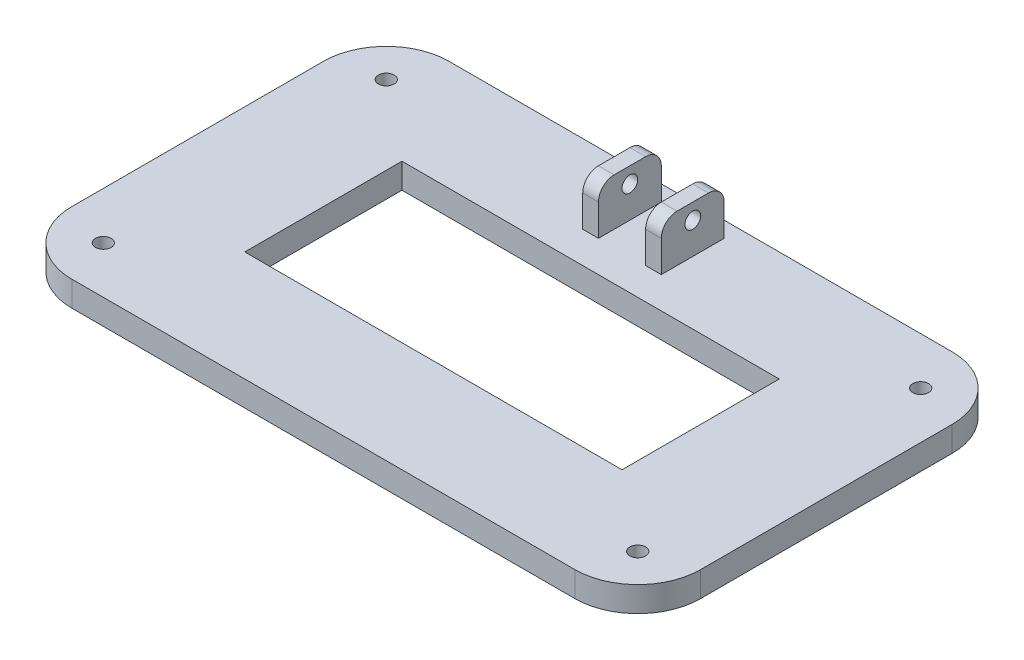
ISO-10303-21;
HEADER;
FILE_DESCRIPTION(('STEP AP214'),'2;1');
FILE_NAME('part.step','',(''),(''),'','','');
FILE_SCHEMA(('AUTOMOTIVE_DESIGN { 1 0 10303 214 1 1 1 1 }'));
ENDSEC;
DATA;
#1=APPLICATION_CONTEXT('core data for automotive mechanical design processes');
#2=APPLICATION_PROTOCOL_DEFINITION('international standard','automotive_design',2000,#1);
#3=PRODUCT_CONTEXT('',#1,'mechanical');
#4=PRODUCT('Part','Part','',(#3));
#5=PRODUCT_RELATED_PRODUCT_CATEGORY('part','',(#4));
#6=PRODUCT_DEFINITION_FORMATION('','',#4);
#7=PRODUCT_DEFINITION_CONTEXT('part definition',#1,'design');
#8=PRODUCT_DEFINITION('design','',#6,#7);
#9=PRODUCT_DEFINITION_SHAPE('','',#8);
#10=(LENGTH_UNIT() NAMED_UNIT(*) SI_UNIT(.MILLI.,.METRE.));
#11=(NAMED_UNIT(*) PLANE_ANGLE_UNIT() SI_UNIT($,.RADIAN.));
#12=(NAMED_UNIT(*) SI_UNIT($,.STERADIAN.) SOLID_ANGLE_UNIT());
#13=UNCERTAINTY_MEASURE_WITH_UNIT(LENGTH_MEASURE(1.E-05),#10,'distance_accuracy_value','');
#14=(GEOMETRIC_REPRESENTATION_CONTEXT(3) GLOBAL_UNCERTAINTY_ASSIGNED_CONTEXT((#13)) GLOBAL_UNIT_ASSIGNED_CONTEXT((#10,
#11,#12)) REPRESENTATION_CONTEXT('',''));
#15=CARTESIAN_POINT('',(0.,0.,0.));
#16=DIRECTION('',(0.,0.,1.));
#17=DIRECTION('',(1.,0.,0.));
#18=AXIS2_PLACEMENT_3D('',#15,#16,#17);
#19=CARTESIAN_POINT('',(-80.,8.,-40.));
#20=DIRECTION('',(0.,1.,0.));
#21=DIRECTION('',(0.,0.,1.));
#22=AXIS2_PLACEMENT_3D('',#19,#20,#21);
#23=PLANE('',#22);
#24=DIRECTION('',(0.,0.,1.));
#25=VECTOR('',#24,1.);
#26=CARTESIAN_POINT('',(12.5,8.,0.));
#27=LINE('',#26,#25);
#28=CARTESIAN_POINT('',(12.5,8.,-55.));
#29=VERTEX_POINT('',#28);
#30=CARTESIAN_POINT('',(12.5,8.,-35.));
#31=VERTEX_POINT('',#30);
#32=EDGE_CURVE('E221',#29,#31,#27,.T.);
#33=ORIENTED_EDGE('',*,*,#32,.T.);
#34=DIRECTION('',(1.,0.,0.));
#35=VECTOR('',#34,1.);
#36=CARTESIAN_POINT('',(0.,8.,-35.));
#37=LINE('',#36,#35);
#38=CARTESIAN_POINT('',(7.50000000000001,8.,-35.));
#39=VERTEX_POINT('',#38);
#40=EDGE_CURVE('E260',#39,#31,#37,.T.);
#41=ORIENTED_EDGE('',*,*,#40,.F.);
#42=DIRECTION('',(0.,0.,1.));
#43=VECTOR('',#42,1.);
#44=CARTESIAN_POINT('',(7.50000000000001,8.,0.));
#45=LINE('',#44,#43);
#46=CARTESIAN_POINT('',(7.5,8.,-55.));
#47=VERTEX_POINT('',#46);
#48=EDGE_CURVE('E272',#47,#39,#45,.T.);
#49=ORIENTED_EDGE('',*,*,#48,.F.);
#50=DIRECTION('',(1.,0.,0.));
#51=VECTOR('',#50,1.);
#52=CARTESIAN_POINT('',(0.,8.,-55.));
#53=LINE('',#52,#51);
#54=EDGE_CURVE('E268',#47,#29,#53,.T.);
#55=ORIENTED_EDGE('',*,*,#54,.T.);
#56=EDGE_LOOP('',(#33,#41,#49,#55));
#57=FACE_BOUND('',#56,.T.);
#58=CARTESIAN_POINT('',(85.,8.,-45.));
#59=DIRECTION('',(0.,-1.,0.));
#60=DIRECTION('',(0.,0.,-1.));
#61=AXIS2_PLACEMENT_3D('',#58,#59,#60);
#62=CIRCLE('',#61,2.50000000000001);
#63=CARTESIAN_POINT('',(85.,8.,-47.5));
#64=VERTEX_POINT('',#63);
#65=EDGE_CURVE('E290',#64,#64,#62,.T.);
#66=ORIENTED_EDGE('',*,*,#65,.T.);
#67=EDGE_LOOP('',(#66));
#68=FACE_BOUND('',#67,.T.);
#69=CARTESIAN_POINT('',(-85.,8.,-45.));
#70=DIRECTION('',(0.,1.,0.));
#71=DIRECTION('',(0.,0.,-1.));
#72=AXIS2_PLACEMENT_3D('',#69,#70,#71);
#73=CIRCLE('',#72,2.50000000000001);
#74=CARTESIAN_POINT('',(-85.,8.,-47.5));
#75=VERTEX_POINT('',#74);
#76=EDGE_CURVE('E295',#75,#75,#73,.T.);
#77=ORIENTED_EDGE('',*,*,#76,.F.);
#78=EDGE_LOOP('',(#77));
#79=FACE_BOUND('',#78,.T.);
#80=CARTESIAN_POINT('',(-85.,8.,45.));
#81=DIRECTION('',(0.,-1.,0.));
#82=DIRECTION('',(0.,0.,1.));
#83=AXIS2_PLACEMENT_3D('',#80,#81,#82);
#84=CIRCLE('',#83,2.50000000000001);
#85=CARTESIAN_POINT('',(-85.,8.,47.5));
#86=VERTEX_POINT('',#85);
#87=EDGE_CURVE('E300',#86,#86,#84,.T.);
#88=ORIENTED_EDGE('',*,*,#87,.T.);
#89=EDGE_LOOP('',(#88));
#90=FACE_BOUND('',#89,.T.);
#91=CARTESIAN_POINT('',(85.,8.,45.));
#92=DIRECTION('',(0.,1.,0.));
#93=DIRECTION('',(0.,0.,1.));
#94=AXIS2_PLACEMENT_3D('',#91,#92,#93);
#95=CIRCLE('',#94,2.50000000000001);
#96=CARTESIAN_POINT('',(85.,8.,47.5));
#97=VERTEX_POINT('',#96);
#98=EDGE_CURVE('E305',#97,#97,#95,.T.);
#99=ORIENTED_EDGE('',*,*,#98,.F.);
#100=EDGE_LOOP('',(#99));
#101=FACE_BOUND('',#100,.T.);
#102=CARTESIAN_POINT('',(-80.,8.,-40.));
#103=DIRECTION('',(0.,1.,0.));
#104=DIRECTION('',(0.,0.,1.));
#105=AXIS2_PLACEMENT_3D('',#102,#103,#104);
#106=CIRCLE('',#105,20.);
#107=CARTESIAN_POINT('',(-79.9999999999999,8.,-60.));
#108=VERTEX_POINT('',#107);
#109=CARTESIAN_POINT('',(-100.,8.,-39.9999999999999));
#110=VERTEX_POINT('',#109);
#111=EDGE_CURVE('E354',#108,#110,#106,.T.);
#112=ORIENTED_EDGE('',*,*,#111,.T.);
#113=DIRECTION('',(0.,0.,1.));
#114=VECTOR('',#113,1.);
#115=CARTESIAN_POINT('',(-100.,8.,-39.9999999999999));
#116=LINE('',#115,#114);
#117=CARTESIAN_POINT('',(-100.,8.,39.9999999999999));
#118=VERTEX_POINT('',#117);
#119=EDGE_CURVE('E358',#110,#118,#116,.T.);
#120=ORIENTED_EDGE('',*,*,#119,.T.);
#121=CARTESIAN_POINT('',(-80.,8.,40.));
#122=DIRECTION('',(0.,1.,0.));
#123=DIRECTION('',(0.,0.,1.));
#124=AXIS2_PLACEMENT_3D('',#121,#122,#123);
#125=CIRCLE('',#124,20.);
#126=CARTESIAN_POINT('',(-79.9999999999998,8.,60.));
#127=VERTEX_POINT('',#126);
#128=EDGE_CURVE('E362',#118,#127,#125,.T.);
#129=ORIENTED_EDGE('',*,*,#128,.T.);
#130=DIRECTION('',(1.,0.,0.));
#131=VECTOR('',#130,1.);
#132=CARTESIAN_POINT('',(-79.9999999999998,8.,60.));
#133=LINE('',#132,#131);
#134=CARTESIAN_POINT('',(79.9999999999999,8.,60.));
#135=VERTEX_POINT('',#134);
#136=EDGE_CURVE('E365',#127,#135,#133,.T.);
#137=ORIENTED_EDGE('',*,*,#136,.T.);
#138=CARTESIAN_POINT('',(80.,8.,40.));
#139=DIRECTION('',(0.,1.,0.));
#140=DIRECTION('',(0.,0.,-1.));
#141=AXIS2_PLACEMENT_3D('',#138,#139,#140);
#142=CIRCLE('',#141,20.);
#143=CARTESIAN_POINT('',(100.,8.,39.9999999999999));
#144=VERTEX_POINT('',#143);
#145=EDGE_CURVE('E368',#135,#144,#142,.T.);
#146=ORIENTED_EDGE('',*,*,#145,.T.);
#147=DIRECTION('',(0.,0.,-1.));
#148=VECTOR('',#147,1.);
#149=CARTESIAN_POINT('',(100.,8.,-39.9999999999999));
#150=LINE('',#149,#148);
#151=CARTESIAN_POINT('',(100.,8.,-39.9999999999999));
#152=VERTEX_POINT('',#151);
#153=EDGE_CURVE('E371',#144,#152,#150,.T.);
#154=ORIENTED_EDGE('',*,*,#153,.T.);
#155=CARTESIAN_POINT('',(80.,8.,-40.));
#156=DIRECTION('',(0.,1.,0.));
#157=DIRECTION('',(0.,0.,1.));
#158=AXIS2_PLACEMENT_3D('',#155,#156,#157);
#159=CIRCLE('',#158,20.);
#160=CARTESIAN_POINT('',(79.9999999999999,8.,-60.));
#161=VERTEX_POINT('',#160);
#162=EDGE_CURVE('E374',#152,#161,#159,.T.);
#163=ORIENTED_EDGE('',*,*,#162,.T.);
#164=DIRECTION('',(-1.,0.,0.));
#165=VECTOR('',#164,1.);
#166=CARTESIAN_POINT('',(-79.9999999999999,8.,-60.));
#167=LINE('',#166,#165);
#168=EDGE_CURVE('E377',#161,#108,#167,.T.);
#169=ORIENTED_EDGE('',*,*,#168,.T.);
#170=EDGE_LOOP('',(#112,#120,#129,#137,#146,#154,#163,#169));
#171=FACE_BOUND('',#170,.T.);
#172=DIRECTION('',(-1.,0.,0.));
#173=VECTOR('',#172,1.);
#174=CARTESIAN_POINT('',(-60.,8.,-25.));
#175=LINE('',#174,#173);
#176=CARTESIAN_POINT('',(60.,8.,-25.));
#177=VERTEX_POINT('',#176);
#178=CARTESIAN_POINT('',(-60.,8.,-25.));
#179=VERTEX_POINT('',#178);
#180=EDGE_CURVE('E313',#177,#179,#175,.T.);
#181=ORIENTED_EDGE('',*,*,#180,.F.);
#182=DIRECTION('',(0.,0.,-1.));
#183=VECTOR('',#182,1.);
#184=CARTESIAN_POINT('',(60.,8.,-25.));
#185=LINE('',#184,#183);
#186=CARTESIAN_POINT('',(60.,8.,25.));
#187=VERTEX_POINT('',#186);
#188=EDGE_CURVE('E310',#187,#177,#185,.T.);
#189=ORIENTED_EDGE('',*,*,#188,.F.);
#190=DIRECTION('',(1.,0.,0.));
#191=VECTOR('',#190,1.);
#192=CARTESIAN_POINT('',(-60.,8.,25.));
#193=LINE('',#192,#191);
#194=CARTESIAN_POINT('',(-60.,8.,25.));
#195=VERTEX_POINT('',#194);
#196=EDGE_CURVE('E321',#195,#187,#193,.T.);
#197=ORIENTED_EDGE('',*,*,#196,.F.);
#198=DIRECTION('',(0.,0.,1.));
#199=VECTOR('',#198,1.);
#200=CARTESIAN_POINT('',(-60.,8.,-25.));
#201=LINE('',#200,#199);
#202=EDGE_CURVE('E317',#179,#195,#201,.T.);
#203=ORIENTED_EDGE('',*,*,#202,.F.);
#204=EDGE_LOOP('',(#181,#189,#197,#203));
#205=FACE_BOUND('',#204,.T.);
#206=DIRECTION('',(-1.,0.,0.));
#207=VECTOR('',#206,1.);
#208=CARTESIAN_POINT('',(0.,8.,-35.));
#209=LINE('',#208,#207);
#210=CARTESIAN_POINT('',(-7.5,8.,-35.));
#211=VERTEX_POINT('',#210);
#212=CARTESIAN_POINT('',(-12.5,8.,-35.));
#213=VERTEX_POINT('',#212);
#214=EDGE_CURVE('E216',#211,#213,#209,.T.);
#215=ORIENTED_EDGE('',*,*,#214,.T.);
#216=DIRECTION('',(0.,0.,1.));
#217=VECTOR('',#216,1.);
#218=CARTESIAN_POINT('',(-12.5,8.,0.));
#219=LINE('',#218,#217);
#220=CARTESIAN_POINT('',(-12.5,8.,-55.));
#221=VERTEX_POINT('',#220);
#222=EDGE_CURVE('E225',#221,#213,#219,.T.);
#223=ORIENTED_EDGE('',*,*,#222,.F.);
#224=DIRECTION('',(-1.,0.,0.));
#225=VECTOR('',#224,1.);
#226=CARTESIAN_POINT('',(0.,8.,-55.));
#227=LINE('',#226,#225);
#228=CARTESIAN_POINT('',(-7.49999999999999,8.,-55.));
#229=VERTEX_POINT('',#228);
#230=EDGE_CURVE('E240',#229,#221,#227,.T.);
#231=ORIENTED_EDGE('',*,*,#230,.F.);
#232=DIRECTION('',(0.,0.,1.));
#233=VECTOR('',#232,1.);
#234=CARTESIAN_POINT('',(-7.50000000000001,8.,0.));
#235=LINE('',#234,#233);
#236=EDGE_CURVE('E236',#229,#211,#235,.T.);
#237=ORIENTED_EDGE('',*,*,#236,.T.);
#238=EDGE_LOOP('',(#215,#223,#231,#237));
#239=FACE_BOUND('',#238,.T.);
#240=ADVANCED_FACE('F47',(#57,#68,#79,#90,#101,#171,#205,#239),#23,.T.);
#241=CARTESIAN_POINT('',(-80.,0.,-40.));
#242=DIRECTION('',(0.,1.,0.));
#243=DIRECTION('',(0.,0.,1.));
#244=AXIS2_PLACEMENT_3D('',#241,#242,#243);
#245=PLANE('',#244);
#246=CARTESIAN_POINT('',(85.,0.,-45.));
#247=DIRECTION('',(0.,1.,0.));
#248=DIRECTION('',(0.,0.,1.));
#249=AXIS2_PLACEMENT_3D('',#246,#247,#248);
#250=CIRCLE('',#249,2.50000000000001);
#251=CARTESIAN_POINT('',(85.,0.,-42.5));
#252=VERTEX_POINT('',#251);
#253=EDGE_CURVE('E294',#252,#252,#250,.F.);
#254=ORIENTED_EDGE('',*,*,#253,.F.);
#255=EDGE_LOOP('',(#254));
#256=FACE_BOUND('',#255,.T.);
#257=CARTESIAN_POINT('',(-85.,0.,-45.));
#258=DIRECTION('',(0.,1.,0.));
#259=DIRECTION('',(0.,0.,1.));
#260=AXIS2_PLACEMENT_3D('',#257,#258,#259);
#261=CIRCLE('',#260,2.50000000000001);
#262=CARTESIAN_POINT('',(-85.,0.,-42.5));
#263=VERTEX_POINT('',#262);
#264=EDGE_CURVE('E299',#263,#263,#261,.T.);
#265=ORIENTED_EDGE('',*,*,#264,.T.);
#266=EDGE_LOOP('',(#265));
#267=FACE_BOUND('',#266,.T.);
#268=CARTESIAN_POINT('',(-85.,0.,45.));
#269=DIRECTION('',(0.,1.,0.));
#270=DIRECTION('',(0.,0.,1.));
#271=AXIS2_PLACEMENT_3D('',#268,#269,#270);
#272=CIRCLE('',#271,2.50000000000001);
#273=CARTESIAN_POINT('',(-85.,0.,47.5));
#274=VERTEX_POINT('',#273);
#275=EDGE_CURVE('E304',#274,#274,#272,.F.);
#276=ORIENTED_EDGE('',*,*,#275,.F.);
#277=EDGE_LOOP('',(#276));
#278=FACE_BOUND('',#277,.T.);
#279=CARTESIAN_POINT('',(85.,0.,45.));
#280=DIRECTION('',(0.,1.,0.));
#281=DIRECTION('',(0.,0.,1.));
#282=AXIS2_PLACEMENT_3D('',#279,#280,#281);
#283=CIRCLE('',#282,2.50000000000001);
#284=CARTESIAN_POINT('',(85.,0.,47.5));
#285=VERTEX_POINT('',#284);
#286=EDGE_CURVE('E309',#285,#285,#283,.T.);
#287=ORIENTED_EDGE('',*,*,#286,.T.);
#288=EDGE_LOOP('',(#287));
#289=FACE_BOUND('',#288,.T.);
#290=CARTESIAN_POINT('',(-80.,0.,-40.));
#291=DIRECTION('',(0.,1.,0.));
#292=DIRECTION('',(0.,0.,1.));
#293=AXIS2_PLACEMENT_3D('',#290,#291,#292);
#294=CIRCLE('',#293,20.);
#295=CARTESIAN_POINT('',(-79.9999999999999,0.,-60.));
#296=VERTEX_POINT('',#295);
#297=CARTESIAN_POINT('',(-100.,0.,-39.9999999999999));
#298=VERTEX_POINT('',#297);
#299=EDGE_CURVE('E353',#296,#298,#294,.T.);
#300=ORIENTED_EDGE('',*,*,#299,.F.);
#301=DIRECTION('',(-1.,0.,0.));
#302=VECTOR('',#301,1.);
#303=CARTESIAN_POINT('',(-79.9999999999999,0.,-60.));
#304=LINE('',#303,#302);
#305=CARTESIAN_POINT('',(79.9999999999999,0.,-60.));
#306=VERTEX_POINT('',#305);
#307=EDGE_CURVE('E359',#306,#296,#304,.T.);
#308=ORIENTED_EDGE('',*,*,#307,.F.);
#309=CARTESIAN_POINT('',(80.,0.,-40.));
#310=DIRECTION('',(0.,1.,0.));
#311=DIRECTION('',(0.,0.,1.));
#312=AXIS2_PLACEMENT_3D('',#309,#310,#311);
#313=CIRCLE('',#312,20.);
#314=CARTESIAN_POINT('',(100.,0.,-39.9999999999999));
#315=VERTEX_POINT('',#314);
#316=EDGE_CURVE('E399',#315,#306,#313,.T.);
#317=ORIENTED_EDGE('',*,*,#316,.F.);
#318=DIRECTION('',(0.,0.,-1.));
#319=VECTOR('',#318,1.);
#320=CARTESIAN_POINT('',(100.,0.,-39.9999999999999));
#321=LINE('',#320,#319);
#322=CARTESIAN_POINT('',(100.,0.,39.9999999999999));
#323=VERTEX_POINT('',#322);
#324=EDGE_CURVE('E396',#323,#315,#321,.T.);
#325=ORIENTED_EDGE('',*,*,#324,.F.);
#326=CARTESIAN_POINT('',(80.,0.,40.));
#327=DIRECTION('',(0.,1.,0.));
#328=DIRECTION('',(0.,0.,-1.));
#329=AXIS2_PLACEMENT_3D('',#326,#327,#328);
#330=CIRCLE('',#329,20.);
#331=CARTESIAN_POINT('',(79.9999999999999,0.,60.));
#332=VERTEX_POINT('',#331);
#333=EDGE_CURVE('E393',#332,#323,#330,.T.);
#334=ORIENTED_EDGE('',*,*,#333,.F.);
#335=DIRECTION('',(1.,0.,0.));
#336=VECTOR('',#335,1.);
#337=CARTESIAN_POINT('',(-79.9999999999998,0.,60.));
#338=LINE('',#337,#336);
#339=CARTESIAN_POINT('',(-79.9999999999998,0.,60.));
#340=VERTEX_POINT('',#339);
#341=EDGE_CURVE('E390',#340,#332,#338,.T.);
#342=ORIENTED_EDGE('',*,*,#341,.F.);
#343=CARTESIAN_POINT('',(-80.,0.,40.));
#344=DIRECTION('',(0.,1.,0.));
#345=DIRECTION('',(0.,0.,1.));
#346=AXIS2_PLACEMENT_3D('',#343,#344,#345);
#347=CIRCLE('',#346,20.);
#348=CARTESIAN_POINT('',(-100.,0.,39.9999999999999));
#349=VERTEX_POINT('',#348);
#350=EDGE_CURVE('E387',#349,#340,#347,.T.);
#351=ORIENTED_EDGE('',*,*,#350,.F.);
#352=DIRECTION('',(0.,0.,1.));
#353=VECTOR('',#352,1.);
#354=CARTESIAN_POINT('',(-100.,0.,-39.9999999999999));
#355=LINE('',#354,#353);
#356=EDGE_CURVE('E384',#298,#349,#355,.T.);
#357=ORIENTED_EDGE('',*,*,#356,.F.);
#358=EDGE_LOOP('',(#300,#308,#317,#325,#334,#342,#351,#357));
#359=FACE_BOUND('',#358,.T.);
#360=DIRECTION('',(0.,0.,-1.));
#361=VECTOR('',#360,1.);
#362=CARTESIAN_POINT('',(60.,0.,-25.));
#363=LINE('',#362,#361);
#364=CARTESIAN_POINT('',(60.,0.,25.));
#365=VERTEX_POINT('',#364);
#366=CARTESIAN_POINT('',(60.,0.,-25.));
#367=VERTEX_POINT('',#366);
#368=EDGE_CURVE('E325',#365,#367,#363,.T.);
#369=ORIENTED_EDGE('',*,*,#368,.T.);
#370=DIRECTION('',(-1.,0.,0.));
#371=VECTOR('',#370,1.);
#372=CARTESIAN_POINT('',(-60.,0.,-25.));
#373=LINE('',#372,#371);
#374=CARTESIAN_POINT('',(-60.,0.,-25.));
#375=VERTEX_POINT('',#374);
#376=EDGE_CURVE('E329',#367,#375,#373,.T.);
#377=ORIENTED_EDGE('',*,*,#376,.T.);
#378=DIRECTION('',(0.,0.,1.));
#379=VECTOR('',#378,1.);
#380=CARTESIAN_POINT('',(-60.,0.,-25.));
#381=LINE('',#380,#379);
#382=CARTESIAN_POINT('',(-60.,0.,25.));
#383=VERTEX_POINT('',#382);
#384=EDGE_CURVE('E333',#375,#383,#381,.T.);
#385=ORIENTED_EDGE('',*,*,#384,.T.);
#386=DIRECTION('',(1.,0.,0.));
#387=VECTOR('',#386,1.);
#388=CARTESIAN_POINT('',(-60.,0.,25.));
#389=LINE('',#388,#387);
#390=EDGE_CURVE('E314',#383,#365,#389,.T.);
#391=ORIENTED_EDGE('',*,*,#390,.T.);
#392=EDGE_LOOP('',(#369,#377,#385,#391));
#393=FACE_BOUND('',#392,.T.);
#394=ADVANCED_FACE('F537',(#256,#267,#278,#289,#359,#393),#245,.F.);
#395=CARTESIAN_POINT('',(-80.,8.,-40.));
#396=DIRECTION('',(0.,-1.,0.));
#397=DIRECTION('',(0.,0.,-1.));
#398=AXIS2_PLACEMENT_3D('',#395,#396,#397);
#399=CYLINDRICAL_SURFACE('',#398,20.);
#400=ORIENTED_EDGE('',*,*,#299,.T.);
#401=DIRECTION('',(0.,-1.,0.));
#402=VECTOR('',#401,1.);
#403=CARTESIAN_POINT('',(-100.,8.,-39.9999999999999));
#404=LINE('',#403,#402);
#405=EDGE_CURVE('E431',#110,#298,#404,.T.);
#406=ORIENTED_EDGE('',*,*,#405,.F.);
#407=ORIENTED_EDGE('',*,*,#111,.F.);
#408=DIRECTION('',(0.,-1.,0.));
#409=VECTOR('',#408,1.);
#410=CARTESIAN_POINT('',(-79.9999999999999,8.,-60.));
#411=LINE('',#410,#409);
#412=EDGE_CURVE('E380',#108,#296,#411,.T.);
#413=ORIENTED_EDGE('',*,*,#412,.T.);
#414=EDGE_LOOP('',(#400,#406,#407,#413));
#415=FACE_BOUND('',#414,.T.);
#416=ADVANCED_FACE('F544',(#415),#399,.T.);
#417=CARTESIAN_POINT('',(-100.,8.,-39.9999999999999));
#418=DIRECTION('',(1.,0.,0.));
#419=DIRECTION('',(0.,0.,-1.));
#420=AXIS2_PLACEMENT_3D('',#417,#418,#419);
#421=PLANE('',#420);
#422=ORIENTED_EDGE('',*,*,#356,.T.);
#423=DIRECTION('',(0.,-1.,0.));
#424=VECTOR('',#423,1.);
#425=CARTESIAN_POINT('',(-100.,8.,39.9999999999999));
#426=LINE('',#425,#424);
#427=EDGE_CURVE('E427',#118,#349,#426,.T.);
#428=ORIENTED_EDGE('',*,*,#427,.F.);
#429=ORIENTED_EDGE('',*,*,#119,.F.);
#430=ORIENTED_EDGE('',*,*,#405,.T.);
#431=EDGE_LOOP('',(#422,#428,#429,#430));
#432=FACE_BOUND('',#431,.T.);
#433=ADVANCED_FACE('F575',(#432),#421,.F.);
#434=CARTESIAN_POINT('',(-80.,8.,40.));
#435=DIRECTION('',(0.,-1.,0.));
#436=DIRECTION('',(0.,0.,-1.));
#437=AXIS2_PLACEMENT_3D('',#434,#435,#436);
#438=CYLINDRICAL_SURFACE('',#437,20.);
#439=ORIENTED_EDGE('',*,*,#350,.T.);
#440=DIRECTION('',(0.,-1.,0.));
#441=VECTOR('',#440,1.);
#442=CARTESIAN_POINT('',(-79.9999999999998,8.,60.));
#443=LINE('',#442,#441);
#444=EDGE_CURVE('E423',#127,#340,#443,.T.);
#445=ORIENTED_EDGE('',*,*,#444,.F.);
#446=ORIENTED_EDGE('',*,*,#128,.F.);
#447=ORIENTED_EDGE('',*,*,#427,.T.);
#448=EDGE_LOOP('',(#439,#445,#446,#447));
#449=FACE_BOUND('',#448,.T.);
#450=ADVANCED_FACE('F571',(#449),#438,.T.);
#451=CARTESIAN_POINT('',(-79.9999999999998,8.,60.));
#452=DIRECTION('',(0.,0.,-1.));
#453=DIRECTION('',(-1.,0.,0.));
#454=AXIS2_PLACEMENT_3D('',#451,#452,#453);
#455=PLANE('',#454);
#456=ORIENTED_EDGE('',*,*,#341,.T.);
#457=DIRECTION('',(0.,-1.,0.));
#458=VECTOR('',#457,1.);
#459=CARTESIAN_POINT('',(79.9999999999999,8.,60.));
#460=LINE('',#459,#458);
#461=EDGE_CURVE('E419',#135,#332,#460,.T.);
#462=ORIENTED_EDGE('',*,*,#461,.F.);
#463=ORIENTED_EDGE('',*,*,#136,.F.);
#464=ORIENTED_EDGE('',*,*,#444,.T.);
#465=EDGE_LOOP('',(#456,#462,#463,#464));
#466=FACE_BOUND('',#465,.T.);
#467=ADVANCED_FACE('F567',(#466),#455,.F.);
#468=CARTESIAN_POINT('',(80.,8.,40.));
#469=DIRECTION('',(0.,-1.,0.));
#470=DIRECTION('',(0.,0.,-1.));
#471=AXIS2_PLACEMENT_3D('',#468,#469,#470);
#472=CYLINDRICAL_SURFACE('',#471,20.);
#473=ORIENTED_EDGE('',*,*,#333,.T.);
#474=DIRECTION('',(0.,-1.,0.));
#475=VECTOR('',#474,1.);
#476=CARTESIAN_POINT('',(100.,8.,39.9999999999999));
#477=LINE('',#476,#475);
#478=EDGE_CURVE('E415',#144,#323,#477,.T.);
#479=ORIENTED_EDGE('',*,*,#478,.F.);
#480=ORIENTED_EDGE('',*,*,#145,.F.);
#481=ORIENTED_EDGE('',*,*,#461,.T.);
#482=EDGE_LOOP('',(#473,#479,#480,#481));
#483=FACE_BOUND('',#482,.T.);
#484=ADVANCED_FACE('F563',(#483),#472,.T.);
#485=CARTESIAN_POINT('',(100.,8.,-39.9999999999999));
#486=DIRECTION('',(-1.,0.,0.));
#487=DIRECTION('',(0.,0.,1.));
#488=AXIS2_PLACEMENT_3D('',#485,#486,#487);
#489=PLANE('',#488);
#490=ORIENTED_EDGE('',*,*,#324,.T.);
#491=DIRECTION('',(0.,-1.,0.));
#492=VECTOR('',#491,1.);
#493=CARTESIAN_POINT('',(100.,8.,-39.9999999999999));
#494=LINE('',#493,#492);
#495=EDGE_CURVE('E411',#152,#315,#494,.T.);
#496=ORIENTED_EDGE('',*,*,#495,.F.);
#497=ORIENTED_EDGE('',*,*,#153,.F.);
#498=ORIENTED_EDGE('',*,*,#478,.T.);
#499=EDGE_LOOP('',(#490,#496,#497,#498));
#500=FACE_BOUND('',#499,.T.);
#501=ADVANCED_FACE('F559',(#500),#489,.F.);
#502=CARTESIAN_POINT('',(80.,8.,-40.));
#503=DIRECTION('',(0.,-1.,0.));
#504=DIRECTION('',(0.,0.,-1.));
#505=AXIS2_PLACEMENT_3D('',#502,#503,#504);
#506=CYLINDRICAL_SURFACE('',#505,20.);
#507=ORIENTED_EDGE('',*,*,#316,.T.);
#508=DIRECTION('',(0.,-1.,0.));
#509=VECTOR('',#508,1.);
#510=CARTESIAN_POINT('',(79.9999999999999,8.,-60.));
#511=LINE('',#510,#509);
#512=EDGE_CURVE('E407',#161,#306,#511,.T.);
#513=ORIENTED_EDGE('',*,*,#512,.F.);
#514=ORIENTED_EDGE('',*,*,#162,.F.);
#515=ORIENTED_EDGE('',*,*,#495,.T.);
#516=EDGE_LOOP('',(#507,#513,#514,#515));
#517=FACE_BOUND('',#516,.T.);
#518=ADVANCED_FACE('F555',(#517),#506,.T.);
#519=CARTESIAN_POINT('',(-79.9999999999999,8.,-60.));
#520=DIRECTION('',(0.,0.,1.));
#521=DIRECTION('',(1.,0.,0.));
#522=AXIS2_PLACEMENT_3D('',#519,#520,#521);
#523=PLANE('',#522);
#524=ORIENTED_EDGE('',*,*,#307,.T.);
#525=ORIENTED_EDGE('',*,*,#412,.F.);
#526=ORIENTED_EDGE('',*,*,#168,.F.);
#527=ORIENTED_EDGE('',*,*,#512,.T.);
#528=EDGE_LOOP('',(#524,#525,#526,#527));
#529=FACE_BOUND('',#528,.T.);
#530=ADVANCED_FACE('F552',(#529),#523,.F.);
#531=CARTESIAN_POINT('',(60.,8.,-25.));
#532=DIRECTION('',(-1.,0.,0.));
#533=DIRECTION('',(0.,0.,1.));
#534=AXIS2_PLACEMENT_3D('',#531,#532,#533);
#535=PLANE('',#534);
#536=ORIENTED_EDGE('',*,*,#368,.F.);
#537=DIRECTION('',(0.,-1.,0.));
#538=VECTOR('',#537,1.);
#539=CARTESIAN_POINT('',(60.,8.,25.));
#540=LINE('',#539,#538);
#541=EDGE_CURVE('E324',#187,#365,#540,.T.);
#542=ORIENTED_EDGE('',*,*,#541,.F.);
#543=ORIENTED_EDGE('',*,*,#188,.T.);
#544=DIRECTION('',(0.,-1.,0.));
#545=VECTOR('',#544,1.);
#546=CARTESIAN_POINT('',(60.,8.,-25.));
#547=LINE('',#546,#545);
#548=EDGE_CURVE('E349',#177,#367,#547,.T.);
#549=ORIENTED_EDGE('',*,*,#548,.T.);
#550=EDGE_LOOP('',(#536,#542,#543,#549));
#551=FACE_BOUND('',#550,.T.);
#552=ADVANCED_FACE('F549',(#551),#535,.T.);
#553=CARTESIAN_POINT('',(-60.,8.,-25.));
#554=DIRECTION('',(0.,0.,1.));
#555=DIRECTION('',(1.,0.,0.));
#556=AXIS2_PLACEMENT_3D('',#553,#554,#555);
#557=PLANE('',#556);
#558=ORIENTED_EDGE('',*,*,#376,.F.);
#559=ORIENTED_EDGE('',*,*,#548,.F.);
#560=ORIENTED_EDGE('',*,*,#180,.T.);
#561=DIRECTION('',(0.,-1.,0.));
#562=VECTOR('',#561,1.);
#563=CARTESIAN_POINT('',(-60.,8.,-25.));
#564=LINE('',#563,#562);
#565=EDGE_CURVE('E346',#179,#375,#564,.T.);
#566=ORIENTED_EDGE('',*,*,#565,.T.);
#567=EDGE_LOOP('',(#558,#559,#560,#566));
#568=FACE_BOUND('',#567,.T.);
#569=ADVANCED_FACE('F668',(#568),#557,.T.);
#570=CARTESIAN_POINT('',(-60.,8.,-25.));
#571=DIRECTION('',(1.,0.,0.));
#572=DIRECTION('',(0.,0.,-1.));
#573=AXIS2_PLACEMENT_3D('',#570,#571,#572);
#574=PLANE('',#573);
#575=ORIENTED_EDGE('',*,*,#384,.F.);
#576=ORIENTED_EDGE('',*,*,#565,.F.);
#577=ORIENTED_EDGE('',*,*,#202,.T.);
#578=DIRECTION('',(0.,-1.,0.));
#579=VECTOR('',#578,1.);
#580=CARTESIAN_POINT('',(-60.,8.,25.));
#581=LINE('',#580,#579);
#582=EDGE_CURVE('E343',#195,#383,#581,.T.);
#583=ORIENTED_EDGE('',*,*,#582,.T.);
#584=EDGE_LOOP('',(#575,#576,#577,#583));
#585=FACE_BOUND('',#584,.T.);
#586=ADVANCED_FACE('F665',(#585),#574,.T.);
#587=CARTESIAN_POINT('',(-60.,8.,25.));
#588=DIRECTION('',(0.,0.,-1.));
#589=DIRECTION('',(-1.,0.,0.));
#590=AXIS2_PLACEMENT_3D('',#587,#588,#589);
#591=PLANE('',#590);
#592=ORIENTED_EDGE('',*,*,#390,.F.);
#593=ORIENTED_EDGE('',*,*,#582,.F.);
#594=ORIENTED_EDGE('',*,*,#196,.T.);
#595=ORIENTED_EDGE('',*,*,#541,.T.);
#596=EDGE_LOOP('',(#592,#593,#594,#595));
#597=FACE_BOUND('',#596,.T.);
#598=ADVANCED_FACE('F661',(#597),#591,.T.);
#599=CARTESIAN_POINT('',(85.,-2.,45.));
#600=DIRECTION('',(0.,1.,0.));
#601=DIRECTION('',(0.,0.,1.));
#602=AXIS2_PLACEMENT_3D('',#599,#600,#601);
#603=CYLINDRICAL_SURFACE('',#602,2.50000000000001);
#604=ORIENTED_EDGE('',*,*,#98,.T.);
#605=EDGE_LOOP('',(#604));
#606=FACE_BOUND('',#605,.T.);
#607=ORIENTED_EDGE('',*,*,#286,.F.);
#608=EDGE_LOOP('',(#607));
#609=FACE_BOUND('',#608,.T.);
#610=ADVANCED_FACE('F657',(#606,#609),#603,.F.);
#611=CARTESIAN_POINT('',(-85.,-2.,45.));
#612=DIRECTION('',(0.,1.,0.));
#613=DIRECTION('',(0.,0.,1.));
#614=AXIS2_PLACEMENT_3D('',#611,#612,#613);
#615=CYLINDRICAL_SURFACE('',#614,2.50000000000001);
#616=ORIENTED_EDGE('',*,*,#87,.F.);
#617=EDGE_LOOP('',(#616));
#618=FACE_BOUND('',#617,.T.);
#619=ORIENTED_EDGE('',*,*,#275,.T.);
#620=EDGE_LOOP('',(#619));
#621=FACE_BOUND('',#620,.T.);
#622=ADVANCED_FACE('F653',(#618,#621),#615,.F.);
#623=CARTESIAN_POINT('',(-85.,-2.,-45.));
#624=DIRECTION('',(0.,1.,0.));
#625=DIRECTION('',(0.,0.,1.));
#626=AXIS2_PLACEMENT_3D('',#623,#624,#625);
#627=CYLINDRICAL_SURFACE('',#626,2.50000000000001);
#628=ORIENTED_EDGE('',*,*,#76,.T.);
#629=EDGE_LOOP('',(#628));
#630=FACE_BOUND('',#629,.T.);
#631=ORIENTED_EDGE('',*,*,#264,.F.);
#632=EDGE_LOOP('',(#631));
#633=FACE_BOUND('',#632,.T.);
#634=ADVANCED_FACE('F649',(#630,#633),#627,.F.);
#635=CARTESIAN_POINT('',(85.,-2.,-45.));
#636=DIRECTION('',(0.,1.,0.));
#637=DIRECTION('',(0.,0.,1.));
#638=AXIS2_PLACEMENT_3D('',#635,#636,#637);
#639=CYLINDRICAL_SURFACE('',#638,2.50000000000001);
#640=ORIENTED_EDGE('',*,*,#65,.F.);
#641=EDGE_LOOP('',(#640));
#642=FACE_BOUND('',#641,.T.);
#643=ORIENTED_EDGE('',*,*,#253,.T.);
#644=EDGE_LOOP('',(#643));
#645=FACE_BOUND('',#644,.T.);
#646=ADVANCED_FACE('F645',(#642,#645),#639,.F.);
#647=CARTESIAN_POINT('',(12.5,23.,0.));
#648=DIRECTION('',(1.,0.,0.));
#649=DIRECTION('',(0.,0.,-1.));
#650=AXIS2_PLACEMENT_3D('',#647,#648,#649);
#651=PLANE('',#650);
#652=CARTESIAN_POINT('',(12.5,18.,-45.));
#653=DIRECTION('',(1.,0.,0.));
#654=DIRECTION('',(0.,0.,-1.));
#655=AXIS2_PLACEMENT_3D('',#652,#653,#654);
#656=CIRCLE('',#655,2.5);
#657=CARTESIAN_POINT('',(12.5,18.,-47.5));
#658=VERTEX_POINT('',#657);
#659=EDGE_CURVE('E514',#658,#658,#656,.T.);
#660=ORIENTED_EDGE('',*,*,#659,.F.);
#661=EDGE_LOOP('',(#660));
#662=FACE_BOUND('',#661,.T.);
#663=DIRECTION('',(0.,-1.,0.));
#664=VECTOR('',#663,1.);
#665=CARTESIAN_POINT('',(12.5,23.,-55.));
#666=LINE('',#665,#664);
#667=CARTESIAN_POINT('',(12.5,18.,-55.));
#668=VERTEX_POINT('',#667);
#669=EDGE_CURVE('E287',#668,#29,#666,.T.);
#670=ORIENTED_EDGE('',*,*,#669,.F.);
#671=CARTESIAN_POINT('',(12.5,18.,-50.));
#672=DIRECTION('',(1.,0.,0.));
#673=DIRECTION('',(0.,0.,-1.));
#674=AXIS2_PLACEMENT_3D('',#671,#672,#673);
#675=CIRCLE('',#674,5.);
#676=CARTESIAN_POINT('',(12.5,23.,-50.));
#677=VERTEX_POINT('',#676);
#678=EDGE_CURVE('E454',#668,#677,#675,.T.);
#679=ORIENTED_EDGE('',*,*,#678,.T.);
#680=DIRECTION('',(0.,0.,1.));
#681=VECTOR('',#680,1.);
#682=CARTESIAN_POINT('',(12.5,23.,0.));
#683=LINE('',#682,#681);
#684=CARTESIAN_POINT('',(12.5,23.,-40.));
#685=VERTEX_POINT('',#684);
#686=EDGE_CURVE('E255',#677,#685,#683,.T.);
#687=ORIENTED_EDGE('',*,*,#686,.T.);
#688=CARTESIAN_POINT('',(12.5,18.,-40.));
#689=DIRECTION('',(1.,0.,0.));
#690=DIRECTION('',(0.,0.,-1.));
#691=AXIS2_PLACEMENT_3D('',#688,#689,#690);
#692=CIRCLE('',#691,5.);
#693=CARTESIAN_POINT('',(12.5,18.,-35.));
#694=VERTEX_POINT('',#693);
#695=EDGE_CURVE('E451',#685,#694,#692,.T.);
#696=ORIENTED_EDGE('',*,*,#695,.T.);
#697=DIRECTION('',(0.,-1.,0.));
#698=VECTOR('',#697,1.);
#699=CARTESIAN_POINT('',(12.5,23.,-35.));
#700=LINE('',#699,#698);
#701=EDGE_CURVE('E264',#694,#31,#700,.T.);
#702=ORIENTED_EDGE('',*,*,#701,.T.);
#703=ORIENTED_EDGE('',*,*,#32,.F.);
#704=EDGE_LOOP('',(#670,#679,#687,#696,#702,#703));
#705=FACE_BOUND('',#704,.T.);
#706=ADVANCED_FACE('F626',(#662,#705),#651,.T.);
#707=CARTESIAN_POINT('',(0.,23.,-55.));
#708=DIRECTION('',(0.,0.,-1.));
#709=DIRECTION('',(-1.,0.,0.));
#710=AXIS2_PLACEMENT_3D('',#707,#708,#709);
#711=PLANE('',#710);
#712=DIRECTION('',(0.,-1.,0.));
#713=VECTOR('',#712,1.);
#714=CARTESIAN_POINT('',(7.5,23.,-55.));
#715=LINE('',#714,#713);
#716=CARTESIAN_POINT('',(7.5,18.,-55.));
#717=VERTEX_POINT('',#716);
#718=EDGE_CURVE('E284',#717,#47,#715,.T.);
#719=ORIENTED_EDGE('',*,*,#718,.F.);
#720=DIRECTION('',(1.,0.,0.));
#721=VECTOR('',#720,1.);
#722=CARTESIAN_POINT('',(0.,18.,-55.));
#723=LINE('',#722,#721);
#724=EDGE_CURVE('E435',#717,#668,#723,.T.);
#725=ORIENTED_EDGE('',*,*,#724,.T.);
#726=ORIENTED_EDGE('',*,*,#669,.T.);
#727=ORIENTED_EDGE('',*,*,#54,.F.);
#728=EDGE_LOOP('',(#719,#725,#726,#727));
#729=FACE_BOUND('',#728,.T.);
#730=ADVANCED_FACE('F610',(#729),#711,.T.);
#731=CARTESIAN_POINT('',(7.50000000000001,23.,0.));
#732=DIRECTION('',(1.,0.,0.));
#733=DIRECTION('',(0.,0.,-1.));
#734=AXIS2_PLACEMENT_3D('',#731,#732,#733);
#735=PLANE('',#734);
#736=CARTESIAN_POINT('',(7.5,18.,-45.));
#737=DIRECTION('',(1.,0.,0.));
#738=DIRECTION('',(0.,0.,-1.));
#739=AXIS2_PLACEMENT_3D('',#736,#737,#738);
#740=CIRCLE('',#739,2.5);
#741=CARTESIAN_POINT('',(7.5,18.,-47.5));
#742=VERTEX_POINT('',#741);
#743=EDGE_CURVE('E233',#742,#742,#740,.T.);
#744=ORIENTED_EDGE('',*,*,#743,.T.);
#745=EDGE_LOOP('',(#744));
#746=FACE_BOUND('',#745,.T.);
#747=DIRECTION('',(0.,0.,1.));
#748=VECTOR('',#747,1.);
#749=CARTESIAN_POINT('',(7.50000000000001,23.,0.));
#750=LINE('',#749,#748);
#751=CARTESIAN_POINT('',(7.5,23.,-50.));
#752=VERTEX_POINT('',#751);
#753=CARTESIAN_POINT('',(7.5,23.,-40.));
#754=VERTEX_POINT('',#753);
#755=EDGE_CURVE('E259',#752,#754,#750,.T.);
#756=ORIENTED_EDGE('',*,*,#755,.F.);
#757=CARTESIAN_POINT('',(7.5,18.,-50.));
#758=DIRECTION('',(1.,0.,0.));
#759=DIRECTION('',(0.,0.,-1.));
#760=AXIS2_PLACEMENT_3D('',#757,#758,#759);
#761=CIRCLE('',#760,5.);
#762=EDGE_CURVE('E467',#752,#717,#761,.F.);
#763=ORIENTED_EDGE('',*,*,#762,.T.);
#764=ORIENTED_EDGE('',*,*,#718,.T.);
#765=ORIENTED_EDGE('',*,*,#48,.T.);
#766=DIRECTION('',(0.,-1.,0.));
#767=VECTOR('',#766,1.);
#768=CARTESIAN_POINT('',(7.5,23.,-35.));
#769=LINE('',#768,#767);
#770=CARTESIAN_POINT('',(7.5,18.,-35.));
#771=VERTEX_POINT('',#770);
#772=EDGE_CURVE('E281',#771,#39,#769,.T.);
#773=ORIENTED_EDGE('',*,*,#772,.F.);
#774=CARTESIAN_POINT('',(7.5,18.,-40.));
#775=DIRECTION('',(1.,0.,0.));
#776=DIRECTION('',(0.,0.,-1.));
#777=AXIS2_PLACEMENT_3D('',#774,#775,#776);
#778=CIRCLE('',#777,5.);
#779=EDGE_CURVE('E464',#771,#754,#778,.F.);
#780=ORIENTED_EDGE('',*,*,#779,.T.);
#781=EDGE_LOOP('',(#756,#763,#764,#765,#773,#780));
#782=FACE_BOUND('',#781,.T.);
#783=ADVANCED_FACE('F606',(#746,#782),#735,.F.);
#784=CARTESIAN_POINT('',(0.,23.,-35.));
#785=DIRECTION('',(0.,0.,-1.));
#786=DIRECTION('',(-1.,0.,0.));
#787=AXIS2_PLACEMENT_3D('',#784,#785,#786);
#788=PLANE('',#787);
#789=ORIENTED_EDGE('',*,*,#701,.F.);
#790=DIRECTION('',(1.,0.,0.));
#791=VECTOR('',#790,1.);
#792=CARTESIAN_POINT('',(7.5,18.,-35.));
#793=LINE('',#792,#791);
#794=EDGE_CURVE('E470',#694,#771,#793,.F.);
#795=ORIENTED_EDGE('',*,*,#794,.T.);
#796=ORIENTED_EDGE('',*,*,#772,.T.);
#797=ORIENTED_EDGE('',*,*,#40,.T.);
#798=EDGE_LOOP('',(#789,#795,#796,#797));
#799=FACE_BOUND('',#798,.T.);
#800=ADVANCED_FACE('F609',(#799),#788,.F.);
#801=CARTESIAN_POINT('',(0.,23.,0.));
#802=DIRECTION('',(0.,1.,0.));
#803=DIRECTION('',(0.,0.,1.));
#804=AXIS2_PLACEMENT_3D('',#801,#802,#803);
#805=PLANE('',#804);
#806=ORIENTED_EDGE('',*,*,#686,.F.);
#807=DIRECTION('',(1.,0.,0.));
#808=VECTOR('',#807,1.);
#809=CARTESIAN_POINT('',(0.,23.,-50.));
#810=LINE('',#809,#808);
#811=EDGE_CURVE('E461',#677,#752,#810,.F.);
#812=ORIENTED_EDGE('',*,*,#811,.T.);
#813=ORIENTED_EDGE('',*,*,#755,.T.);
#814=DIRECTION('',(1.,0.,0.));
#815=VECTOR('',#814,1.);
#816=CARTESIAN_POINT('',(12.5,23.,-40.));
#817=LINE('',#816,#815);
#818=EDGE_CURVE('E457',#754,#685,#817,.T.);
#819=ORIENTED_EDGE('',*,*,#818,.T.);
#820=EDGE_LOOP('',(#806,#812,#813,#819));
#821=FACE_BOUND('',#820,.T.);
#822=ADVANCED_FACE('F587',(#821),#805,.T.);
#823=CARTESIAN_POINT('',(0.,18.,-50.));
#824=DIRECTION('',(1.,0.,0.));
#825=DIRECTION('',(0.,0.,-1.));
#826=AXIS2_PLACEMENT_3D('',#823,#824,#825);
#827=CYLINDRICAL_SURFACE('',#826,5.);
#828=ORIENTED_EDGE('',*,*,#762,.F.);
#829=ORIENTED_EDGE('',*,*,#811,.F.);
#830=ORIENTED_EDGE('',*,*,#678,.F.);
#831=ORIENTED_EDGE('',*,*,#724,.F.);
#832=EDGE_LOOP('',(#828,#829,#830,#831));
#833=FACE_BOUND('',#832,.T.);
#834=ADVANCED_FACE('F583',(#833),#827,.T.);
#835=CARTESIAN_POINT('',(0.,18.,-40.));
#836=DIRECTION('',(-1.,0.,0.));
#837=DIRECTION('',(0.,0.,1.));
#838=AXIS2_PLACEMENT_3D('',#835,#836,#837);
#839=CYLINDRICAL_SURFACE('',#838,5.);
#840=ORIENTED_EDGE('',*,*,#779,.F.);
#841=ORIENTED_EDGE('',*,*,#794,.F.);
#842=ORIENTED_EDGE('',*,*,#695,.F.);
#843=ORIENTED_EDGE('',*,*,#818,.F.);
#844=EDGE_LOOP('',(#840,#841,#842,#843));
#845=FACE_BOUND('',#844,.T.);
#846=ADVANCED_FACE('F586',(#845),#839,.T.);
#847=CARTESIAN_POINT('',(-12.5,23.,0.));
#848=DIRECTION('',(1.,0.,0.));
#849=DIRECTION('',(0.,0.,-1.));
#850=AXIS2_PLACEMENT_3D('',#847,#848,#849);
#851=PLANE('',#850);
#852=CARTESIAN_POINT('',(-12.5,18.,-45.));
#853=DIRECTION('',(1.,0.,0.));
#854=DIRECTION('',(0.,0.,-1.));
#855=AXIS2_PLACEMENT_3D('',#852,#853,#854);
#856=CIRCLE('',#855,2.5);
#857=CARTESIAN_POINT('',(-12.5,18.,-47.5));
#858=VERTEX_POINT('',#857);
#859=EDGE_CURVE('E510',#858,#858,#856,.T.);
#860=ORIENTED_EDGE('',*,*,#859,.T.);
#861=EDGE_LOOP('',(#860));
#862=FACE_BOUND('',#861,.T.);
#863=DIRECTION('',(0.,0.,1.));
#864=VECTOR('',#863,1.);
#865=CARTESIAN_POINT('',(-12.5,23.,0.));
#866=LINE('',#865,#864);
#867=CARTESIAN_POINT('',(-12.5,23.,-50.));
#868=VERTEX_POINT('',#867);
#869=CARTESIAN_POINT('',(-12.5,23.,-40.));
#870=VERTEX_POINT('',#869);
#871=EDGE_CURVE('E246',#868,#870,#866,.T.);
#872=ORIENTED_EDGE('',*,*,#871,.F.);
#873=CARTESIAN_POINT('',(-12.5,18.,-50.));
#874=DIRECTION('',(1.,0.,0.));
#875=DIRECTION('',(0.,0.,-1.));
#876=AXIS2_PLACEMENT_3D('',#873,#874,#875);
#877=CIRCLE('',#876,5.);
#878=CARTESIAN_POINT('',(-12.5,18.,-55.));
#879=VERTEX_POINT('',#878);
#880=EDGE_CURVE('E483',#868,#879,#877,.F.);
#881=ORIENTED_EDGE('',*,*,#880,.T.);
#882=DIRECTION('',(0.,-1.,0.));
#883=VECTOR('',#882,1.);
#884=CARTESIAN_POINT('',(-12.5,23.,-55.));
#885=LINE('',#884,#883);
#886=EDGE_CURVE('E228',#879,#221,#885,.T.);
#887=ORIENTED_EDGE('',*,*,#886,.T.);
#888=ORIENTED_EDGE('',*,*,#222,.T.);
#889=DIRECTION('',(0.,-1.,0.));
#890=VECTOR('',#889,1.);
#891=CARTESIAN_POINT('',(-12.5,23.,-35.));
#892=LINE('',#891,#890);
#893=CARTESIAN_POINT('',(-12.5,18.,-35.));
#894=VERTEX_POINT('',#893);
#895=EDGE_CURVE('E212',#894,#213,#892,.T.);
#896=ORIENTED_EDGE('',*,*,#895,.F.);
#897=CARTESIAN_POINT('',(-12.5,18.,-40.));
#898=DIRECTION('',(1.,0.,0.));
#899=DIRECTION('',(0.,0.,-1.));
#900=AXIS2_PLACEMENT_3D('',#897,#898,#899);
#901=CIRCLE('',#900,5.);
#902=EDGE_CURVE('E480',#894,#870,#901,.F.);
#903=ORIENTED_EDGE('',*,*,#902,.T.);
#904=EDGE_LOOP('',(#872,#881,#887,#888,#896,#903));
#905=FACE_BOUND('',#904,.T.);
#906=ADVANCED_FACE('F227',(#862,#905),#851,.F.);
#907=CARTESIAN_POINT('',(0.,23.,-35.));
#908=DIRECTION('',(0.,0.,1.));
#909=DIRECTION('',(1.,0.,0.));
#910=AXIS2_PLACEMENT_3D('',#907,#908,#909);
#911=PLANE('',#910);
#912=DIRECTION('',(0.,-1.,0.));
#913=VECTOR('',#912,1.);
#914=CARTESIAN_POINT('',(-7.5,23.,-35.));
#915=LINE('',#914,#913);
#916=CARTESIAN_POINT('',(-7.5,18.,-35.));
#917=VERTEX_POINT('',#916);
#918=EDGE_CURVE('E222',#917,#211,#915,.T.);
#919=ORIENTED_EDGE('',*,*,#918,.F.);
#920=DIRECTION('',(-1.,0.,0.));
#921=VECTOR('',#920,1.);
#922=CARTESIAN_POINT('',(0.,18.,-35.));
#923=LINE('',#922,#921);
#924=EDGE_CURVE('E11',#917,#894,#923,.T.);
#925=ORIENTED_EDGE('',*,*,#924,.T.);
#926=ORIENTED_EDGE('',*,*,#895,.T.);
#927=ORIENTED_EDGE('',*,*,#214,.F.);
#928=EDGE_LOOP('',(#919,#925,#926,#927));
#929=FACE_BOUND('',#928,.T.);
#930=ADVANCED_FACE('F214',(#929),#911,.T.);
#931=CARTESIAN_POINT('',(-7.50000000000001,23.,0.));
#932=DIRECTION('',(1.,0.,0.));
#933=DIRECTION('',(0.,0.,-1.));
#934=AXIS2_PLACEMENT_3D('',#931,#932,#933);
#935=PLANE('',#934);
#936=CARTESIAN_POINT('',(-7.5,18.,-45.));
#937=DIRECTION('',(1.,0.,0.));
#938=DIRECTION('',(0.,0.,-1.));
#939=AXIS2_PLACEMENT_3D('',#936,#937,#938);
#940=CIRCLE('',#939,2.5);
#941=CARTESIAN_POINT('',(-7.5,18.,-47.5));
#942=VERTEX_POINT('',#941);
#943=EDGE_CURVE('E51',#942,#942,#940,.T.);
#944=ORIENTED_EDGE('',*,*,#943,.F.);
#945=EDGE_LOOP('',(#944));
#946=FACE_BOUND('',#945,.T.);
#947=DIRECTION('',(0.,-1.,0.));
#948=VECTOR('',#947,1.);
#949=CARTESIAN_POINT('',(-7.5,23.,-55.));
#950=LINE('',#949,#948);
#951=CARTESIAN_POINT('',(-7.5,18.,-55.));
#952=VERTEX_POINT('',#951);
#953=EDGE_CURVE('E249',#952,#229,#950,.T.);
#954=ORIENTED_EDGE('',*,*,#953,.F.);
#955=CARTESIAN_POINT('',(-7.5,18.,-50.));
#956=DIRECTION('',(1.,0.,0.));
#957=DIRECTION('',(0.,0.,-1.));
#958=AXIS2_PLACEMENT_3D('',#955,#956,#957);
#959=CIRCLE('',#958,5.);
#960=CARTESIAN_POINT('',(-7.5,23.,-50.));
#961=VERTEX_POINT('',#960);
#962=EDGE_CURVE('E57',#952,#961,#959,.T.);
#963=ORIENTED_EDGE('',*,*,#962,.T.);
#964=DIRECTION('',(0.,0.,1.));
#965=VECTOR('',#964,1.);
#966=CARTESIAN_POINT('',(-7.50000000000001,23.,0.));
#967=LINE('',#966,#965);
#968=CARTESIAN_POINT('',(-7.5,23.,-40.));
#969=VERTEX_POINT('',#968);
#970=EDGE_CURVE('E250',#961,#969,#967,.T.);
#971=ORIENTED_EDGE('',*,*,#970,.T.);
#972=CARTESIAN_POINT('',(-7.5,18.,-40.));
#973=DIRECTION('',(1.,0.,0.));
#974=DIRECTION('',(0.,0.,-1.));
#975=AXIS2_PLACEMENT_3D('',#972,#973,#974);
#976=CIRCLE('',#975,5.);
#977=EDGE_CURVE('E64',#969,#917,#976,.T.);
#978=ORIENTED_EDGE('',*,*,#977,.T.);
#979=ORIENTED_EDGE('',*,*,#918,.T.);
#980=ORIENTED_EDGE('',*,*,#236,.F.);
#981=EDGE_LOOP('',(#954,#963,#971,#978,#979,#980));
#982=FACE_BOUND('',#981,.T.);
#983=ADVANCED_FACE('F493',(#946,#982),#935,.T.);
#984=CARTESIAN_POINT('',(0.,23.,-55.));
#985=DIRECTION('',(0.,0.,1.));
#986=DIRECTION('',(1.,0.,0.));
#987=AXIS2_PLACEMENT_3D('',#984,#985,#986);
#988=PLANE('',#987);
#989=ORIENTED_EDGE('',*,*,#886,.F.);
#990=DIRECTION('',(-1.,0.,0.));
#991=VECTOR('',#990,1.);
#992=CARTESIAN_POINT('',(-7.5,18.,-55.));
#993=LINE('',#992,#991);
#994=EDGE_CURVE('E72',#879,#952,#993,.F.);
#995=ORIENTED_EDGE('',*,*,#994,.T.);
#996=ORIENTED_EDGE('',*,*,#953,.T.);
#997=ORIENTED_EDGE('',*,*,#230,.T.);
#998=EDGE_LOOP('',(#989,#995,#996,#997));
#999=FACE_BOUND('',#998,.T.);
#1000=ADVANCED_FACE('F502',(#999),#988,.F.);
#1001=CARTESIAN_POINT('',(0.,23.,0.));
#1002=DIRECTION('',(0.,1.,0.));
#1003=DIRECTION('',(0.,0.,1.));
#1004=AXIS2_PLACEMENT_3D('',#1001,#1002,#1003);
#1005=PLANE('',#1004);
#1006=ORIENTED_EDGE('',*,*,#970,.F.);
#1007=DIRECTION('',(-1.,0.,0.));
#1008=VECTOR('',#1007,1.);
#1009=CARTESIAN_POINT('',(-12.5,23.,-50.));
#1010=LINE('',#1009,#1008);
#1011=EDGE_CURVE('E476',#961,#868,#1010,.T.);
#1012=ORIENTED_EDGE('',*,*,#1011,.T.);
#1013=ORIENTED_EDGE('',*,*,#871,.T.);
#1014=DIRECTION('',(-1.,0.,0.));
#1015=VECTOR('',#1014,1.);
#1016=CARTESIAN_POINT('',(0.,23.,-40.));
#1017=LINE('',#1016,#1015);
#1018=EDGE_CURVE('E473',#870,#969,#1017,.F.);
#1019=ORIENTED_EDGE('',*,*,#1018,.T.);
#1020=EDGE_LOOP('',(#1006,#1012,#1013,#1019));
#1021=FACE_BOUND('',#1020,.T.);
#1022=ADVANCED_FACE('F497',(#1021),#1005,.T.);
#1023=CARTESIAN_POINT('',(0.,18.,-50.));
#1024=DIRECTION('',(1.,0.,0.));
#1025=DIRECTION('',(0.,0.,-1.));
#1026=AXIS2_PLACEMENT_3D('',#1023,#1024,#1025);
#1027=CYLINDRICAL_SURFACE('',#1026,5.);
#1028=ORIENTED_EDGE('',*,*,#962,.F.);
#1029=ORIENTED_EDGE('',*,*,#994,.F.);
#1030=ORIENTED_EDGE('',*,*,#880,.F.);
#1031=ORIENTED_EDGE('',*,*,#1011,.F.);
#1032=EDGE_LOOP('',(#1028,#1029,#1030,#1031));
#1033=FACE_BOUND('',#1032,.T.);
#1034=ADVANCED_FACE('F501',(#1033),#1027,.T.);
#1035=CARTESIAN_POINT('',(0.,18.,-40.));
#1036=DIRECTION('',(-1.,0.,0.));
#1037=DIRECTION('',(0.,0.,1.));
#1038=AXIS2_PLACEMENT_3D('',#1035,#1036,#1037);
#1039=CYLINDRICAL_SURFACE('',#1038,5.);
#1040=ORIENTED_EDGE('',*,*,#977,.F.);
#1041=ORIENTED_EDGE('',*,*,#1018,.F.);
#1042=ORIENTED_EDGE('',*,*,#902,.F.);
#1043=ORIENTED_EDGE('',*,*,#924,.F.);
#1044=EDGE_LOOP('',(#1040,#1041,#1042,#1043));
#1045=FACE_BOUND('',#1044,.T.);
#1046=ADVANCED_FACE('F49',(#1045),#1039,.T.);
#1047=CARTESIAN_POINT('',(-41.5,18.,-45.));
#1048=DIRECTION('',(1.,0.,0.));
#1049=DIRECTION('',(0.,0.,-1.));
#1050=AXIS2_PLACEMENT_3D('',#1047,#1048,#1049);
#1051=CYLINDRICAL_SURFACE('',#1050,2.5);
#1052=ORIENTED_EDGE('',*,*,#943,.T.);
#1053=EDGE_LOOP('',(#1052));
#1054=FACE_BOUND('',#1053,.T.);
#1055=ORIENTED_EDGE('',*,*,#859,.F.);
#1056=EDGE_LOOP('',(#1055));
#1057=FACE_BOUND('',#1056,.T.);
#1058=ADVANCED_FACE('F523',(#1054,#1057),#1051,.F.);
#1059=ORIENTED_EDGE('',*,*,#659,.T.);
#1060=EDGE_LOOP('',(#1059));
#1061=FACE_BOUND('',#1060,.T.);
#1062=ORIENTED_EDGE('',*,*,#743,.F.);
#1063=EDGE_LOOP('',(#1062));
#1064=FACE_BOUND('',#1063,.T.);
#1065=ADVANCED_FACE('F599',(#1061,#1064),#1051,.F.);
#1066=CLOSED_SHELL('',(#240,#394,#416,#433,#450,#467,#484,#501,#518,#530,#552,#569,#586,#598,
#610,#622,#634,#646,#706,#730,#783,#800,#822,#834,#846,#906,#930,#983,#1000,#1022,#1034,#1046,
#1058,#1065));
#1067=MANIFOLD_SOLID_BREP('B2',#1066);
#1068=ADVANCED_BREP_SHAPE_REPRESENTATION('',(#18,#1067),#14);
#1069=SHAPE_DEFINITION_REPRESENTATION(#9,#1068);
ENDSEC;
END-ISO-10303-21;
